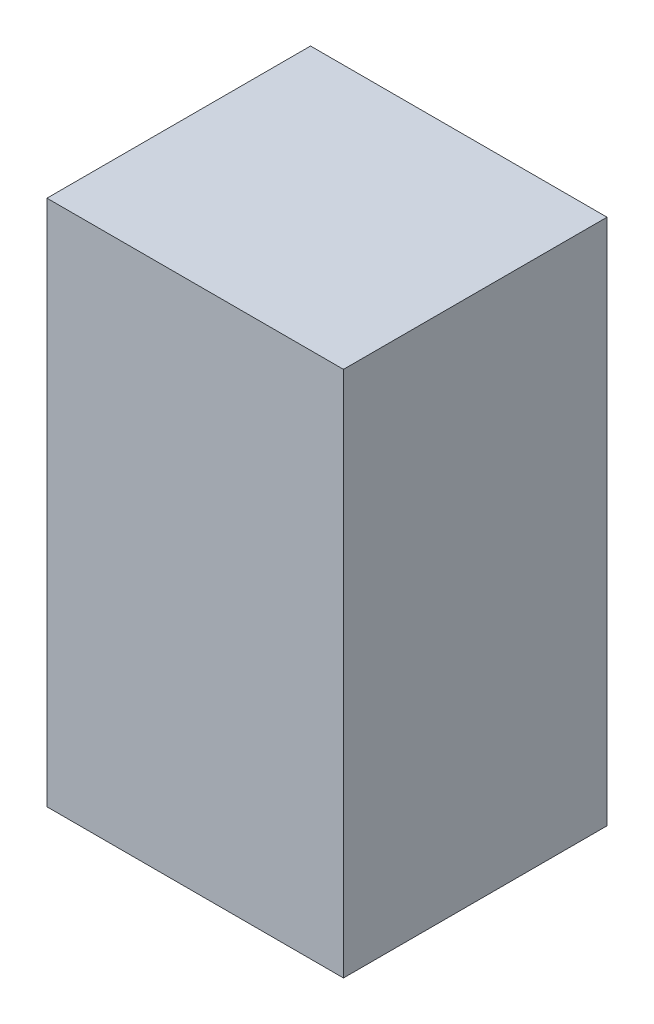
ISO-10303-21;
HEADER;
FILE_DESCRIPTION(('STEP AP214'),'2;1');
FILE_NAME('part.step','',(''),(''),'','','');
FILE_SCHEMA(('AUTOMOTIVE_DESIGN { 1 0 10303 214 1 1 1 1 }'));
ENDSEC;
DATA;
#1=APPLICATION_CONTEXT('core data for automotive mechanical design processes');
#2=APPLICATION_PROTOCOL_DEFINITION('international standard','automotive_design',2000,#1);
#3=PRODUCT_CONTEXT('',#1,'mechanical');
#4=PRODUCT('Part','Part','',(#3));
#5=PRODUCT_RELATED_PRODUCT_CATEGORY('part','',(#4));
#6=PRODUCT_DEFINITION_FORMATION('','',#4);
#7=PRODUCT_DEFINITION_CONTEXT('part definition',#1,'design');
#8=PRODUCT_DEFINITION('design','',#6,#7);
#9=PRODUCT_DEFINITION_SHAPE('','',#8);
#10=(LENGTH_UNIT() NAMED_UNIT(*) SI_UNIT(.MILLI.,.METRE.));
#11=(NAMED_UNIT(*) PLANE_ANGLE_UNIT() SI_UNIT($,.RADIAN.));
#12=(NAMED_UNIT(*) SI_UNIT($,.STERADIAN.) SOLID_ANGLE_UNIT());
#13=UNCERTAINTY_MEASURE_WITH_UNIT(LENGTH_MEASURE(1.E-05),#10,'distance_accuracy_value','');
#14=(GEOMETRIC_REPRESENTATION_CONTEXT(3) GLOBAL_UNCERTAINTY_ASSIGNED_CONTEXT((#13)) GLOBAL_UNIT_ASSIGNED_CONTEXT((#10,
#11,#12)) REPRESENTATION_CONTEXT('',''));
#15=CARTESIAN_POINT('',(0.,0.,0.));
#16=DIRECTION('',(0.,0.,1.));
#17=DIRECTION('',(1.,0.,0.));
#18=AXIS2_PLACEMENT_3D('',#15,#16,#17);
#19=CARTESIAN_POINT('',(520.,220.,-248.));
#20=DIRECTION('',(-1.,0.,0.));
#21=DIRECTION('',(0.,0.,1.));
#22=AXIS2_PLACEMENT_3D('',#19,#20,#21);
#23=PLANE('',#22);
#24=DIRECTION('',(0.,-1.,0.));
#25=VECTOR('',#24,1.);
#26=CARTESIAN_POINT('',(520.,220.,-208.));
#27=LINE('',#26,#25);
#28=CARTESIAN_POINT('',(520.,300.,-208.));
#29=VERTEX_POINT('',#28);
#30=CARTESIAN_POINT('',(520.,220.,-208.));
#31=VERTEX_POINT('',#30);
#32=EDGE_CURVE('E103',#29,#31,#27,.T.);
#33=ORIENTED_EDGE('',*,*,#32,.F.);
#34=DIRECTION('',(0.,0.,1.));
#35=VECTOR('',#34,1.);
#36=CARTESIAN_POINT('',(520.,300.,-248.));
#37=LINE('',#36,#35);
#38=CARTESIAN_POINT('',(520.,300.,-248.));
#39=VERTEX_POINT('',#38);
#40=EDGE_CURVE('E11',#39,#29,#37,.T.);
#41=ORIENTED_EDGE('',*,*,#40,.F.);
#42=DIRECTION('',(0.,-1.,0.));
#43=VECTOR('',#42,1.);
#44=CARTESIAN_POINT('',(520.,220.,-248.));
#45=LINE('',#44,#43);
#46=CARTESIAN_POINT('',(520.,220.,-248.));
#47=VERTEX_POINT('',#46);
#48=EDGE_CURVE('E97',#39,#47,#45,.T.);
#49=ORIENTED_EDGE('',*,*,#48,.T.);
#50=DIRECTION('',(0.,0.,1.));
#51=VECTOR('',#50,1.);
#52=CARTESIAN_POINT('',(520.,220.,-248.));
#53=LINE('',#52,#51);
#54=EDGE_CURVE('E42',#47,#31,#53,.T.);
#55=ORIENTED_EDGE('',*,*,#54,.T.);
#56=EDGE_LOOP('',(#33,#41,#49,#55));
#57=FACE_BOUND('',#56,.T.);
#58=ADVANCED_FACE('F39',(#57),#23,.T.);
#59=CARTESIAN_POINT('',(520.,300.,-248.));
#60=DIRECTION('',(0.,1.,0.));
#61=DIRECTION('',(0.,0.,1.));
#62=AXIS2_PLACEMENT_3D('',#59,#60,#61);
#63=PLANE('',#62);
#64=DIRECTION('',(-1.,0.,0.));
#65=VECTOR('',#64,1.);
#66=CARTESIAN_POINT('',(520.,300.,-208.));
#67=LINE('',#66,#65);
#68=CARTESIAN_POINT('',(565.,300.,-208.));
#69=VERTEX_POINT('',#68);
#70=EDGE_CURVE('E99',#69,#29,#67,.T.);
#71=ORIENTED_EDGE('',*,*,#70,.F.);
#72=DIRECTION('',(0.,0.,1.));
#73=VECTOR('',#72,1.);
#74=CARTESIAN_POINT('',(565.,300.,-248.));
#75=LINE('',#74,#73);
#76=CARTESIAN_POINT('',(565.,300.,-248.));
#77=VERTEX_POINT('',#76);
#78=EDGE_CURVE('E48',#77,#69,#75,.T.);
#79=ORIENTED_EDGE('',*,*,#78,.F.);
#80=DIRECTION('',(-1.,0.,0.));
#81=VECTOR('',#80,1.);
#82=CARTESIAN_POINT('',(520.,300.,-248.));
#83=LINE('',#82,#81);
#84=EDGE_CURVE('E94',#77,#39,#83,.T.);
#85=ORIENTED_EDGE('',*,*,#84,.T.);
#86=ORIENTED_EDGE('',*,*,#40,.T.);
#87=EDGE_LOOP('',(#71,#79,#85,#86));
#88=FACE_BOUND('',#87,.T.);
#89=ADVANCED_FACE('F113',(#88),#63,.T.);
#90=CARTESIAN_POINT('',(565.,220.,-248.));
#91=DIRECTION('',(1.,0.,0.));
#92=DIRECTION('',(0.,0.,-1.));
#93=AXIS2_PLACEMENT_3D('',#90,#91,#92);
#94=PLANE('',#93);
#95=DIRECTION('',(0.,1.,0.));
#96=VECTOR('',#95,1.);
#97=CARTESIAN_POINT('',(565.,220.,-208.));
#98=LINE('',#97,#96);
#99=CARTESIAN_POINT('',(565.,220.,-208.));
#100=VERTEX_POINT('',#99);
#101=EDGE_CURVE('E89',#100,#69,#98,.T.);
#102=ORIENTED_EDGE('',*,*,#101,.F.);
#103=DIRECTION('',(0.,0.,1.));
#104=VECTOR('',#103,1.);
#105=CARTESIAN_POINT('',(565.,220.,-248.));
#106=LINE('',#105,#104);
#107=CARTESIAN_POINT('',(565.,220.,-248.));
#108=VERTEX_POINT('',#107);
#109=EDGE_CURVE('E84',#108,#100,#106,.T.);
#110=ORIENTED_EDGE('',*,*,#109,.F.);
#111=DIRECTION('',(0.,1.,0.));
#112=VECTOR('',#111,1.);
#113=CARTESIAN_POINT('',(565.,220.,-248.));
#114=LINE('',#113,#112);
#115=EDGE_CURVE('E87',#108,#77,#114,.T.);
#116=ORIENTED_EDGE('',*,*,#115,.T.);
#117=ORIENTED_EDGE('',*,*,#78,.T.);
#118=EDGE_LOOP('',(#102,#110,#116,#117));
#119=FACE_BOUND('',#118,.T.);
#120=ADVANCED_FACE('F86',(#119),#94,.T.);
#121=CARTESIAN_POINT('',(520.,220.,-248.));
#122=DIRECTION('',(0.,-1.,0.));
#123=DIRECTION('',(0.,0.,-1.));
#124=AXIS2_PLACEMENT_3D('',#121,#122,#123);
#125=PLANE('',#124);
#126=DIRECTION('',(1.,0.,0.));
#127=VECTOR('',#126,1.);
#128=CARTESIAN_POINT('',(520.,220.,-208.));
#129=LINE('',#128,#127);
#130=EDGE_CURVE('E106',#31,#100,#129,.T.);
#131=ORIENTED_EDGE('',*,*,#130,.F.);
#132=ORIENTED_EDGE('',*,*,#54,.F.);
#133=DIRECTION('',(1.,0.,0.));
#134=VECTOR('',#133,1.);
#135=CARTESIAN_POINT('',(520.,220.,-248.));
#136=LINE('',#135,#134);
#137=EDGE_CURVE('E93',#47,#108,#136,.T.);
#138=ORIENTED_EDGE('',*,*,#137,.T.);
#139=ORIENTED_EDGE('',*,*,#109,.T.);
#140=EDGE_LOOP('',(#131,#132,#138,#139));
#141=FACE_BOUND('',#140,.T.);
#142=ADVANCED_FACE('F96',(#141),#125,.T.);
#143=CARTESIAN_POINT('',(0.,0.,-248.));
#144=DIRECTION('',(0.,0.,-1.));
#145=DIRECTION('',(-1.,0.,0.));
#146=AXIS2_PLACEMENT_3D('',#143,#144,#145);
#147=PLANE('',#146);
#148=ORIENTED_EDGE('',*,*,#48,.F.);
#149=ORIENTED_EDGE('',*,*,#84,.F.);
#150=ORIENTED_EDGE('',*,*,#115,.F.);
#151=ORIENTED_EDGE('',*,*,#137,.F.);
#152=EDGE_LOOP('',(#148,#149,#150,#151));
#153=FACE_BOUND('',#152,.T.);
#154=ADVANCED_FACE('F92',(#153),#147,.T.);
#155=CARTESIAN_POINT('',(0.,0.,-208.));
#156=DIRECTION('',(0.,0.,-1.));
#157=DIRECTION('',(-1.,0.,0.));
#158=AXIS2_PLACEMENT_3D('',#155,#156,#157);
#159=PLANE('',#158);
#160=ORIENTED_EDGE('',*,*,#32,.T.);
#161=ORIENTED_EDGE('',*,*,#130,.T.);
#162=ORIENTED_EDGE('',*,*,#101,.T.);
#163=ORIENTED_EDGE('',*,*,#70,.T.);
#164=EDGE_LOOP('',(#160,#161,#162,#163));
#165=FACE_BOUND('',#164,.T.);
#166=ADVANCED_FACE('F112',(#165),#159,.F.);
#167=CLOSED_SHELL('',(#58,#89,#120,#142,#154,#166));
#168=MANIFOLD_SOLID_BREP('B2',#167);
#169=ADVANCED_BREP_SHAPE_REPRESENTATION('',(#18,#168),#14);
#170=SHAPE_DEFINITION_REPRESENTATION(#9,#169);
ENDSEC;
END-ISO-10303-21;
